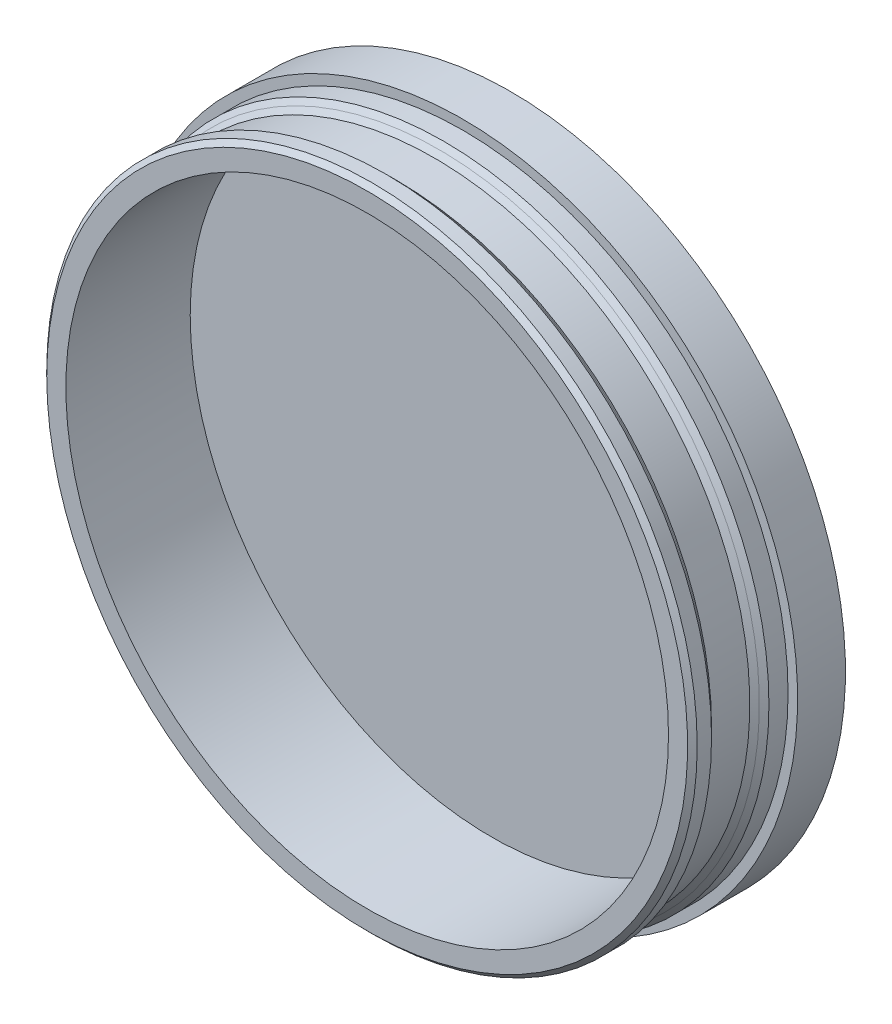
ISO-10303-21;
HEADER;
FILE_DESCRIPTION(('STEP AP214'),'2;1');
FILE_NAME('part.step','',(''),(''),'','','');
FILE_SCHEMA(('AUTOMOTIVE_DESIGN { 1 0 10303 214 1 1 1 1 }'));
ENDSEC;
DATA;
#1=APPLICATION_CONTEXT('core data for automotive mechanical design processes');
#2=APPLICATION_PROTOCOL_DEFINITION('international standard','automotive_design',2000,#1);
#3=PRODUCT_CONTEXT('',#1,'mechanical');
#4=PRODUCT('Part','Part','',(#3));
#5=PRODUCT_RELATED_PRODUCT_CATEGORY('part','',(#4));
#6=PRODUCT_DEFINITION_FORMATION('','',#4);
#7=PRODUCT_DEFINITION_CONTEXT('part definition',#1,'design');
#8=PRODUCT_DEFINITION('design','',#6,#7);
#9=PRODUCT_DEFINITION_SHAPE('','',#8);
#10=(LENGTH_UNIT() NAMED_UNIT(*) SI_UNIT(.MILLI.,.METRE.));
#11=(NAMED_UNIT(*) PLANE_ANGLE_UNIT() SI_UNIT($,.RADIAN.));
#12=(NAMED_UNIT(*) SI_UNIT($,.STERADIAN.) SOLID_ANGLE_UNIT());
#13=UNCERTAINTY_MEASURE_WITH_UNIT(LENGTH_MEASURE(1.E-05),#10,'distance_accuracy_value','');
#14=(GEOMETRIC_REPRESENTATION_CONTEXT(3) GLOBAL_UNCERTAINTY_ASSIGNED_CONTEXT((#13)) GLOBAL_UNIT_ASSIGNED_CONTEXT((#10,
#11,#12)) REPRESENTATION_CONTEXT('',''));
#15=CARTESIAN_POINT('',(0.,0.,0.));
#16=DIRECTION('',(0.,0.,1.));
#17=DIRECTION('',(1.,0.,0.));
#18=AXIS2_PLACEMENT_3D('',#15,#16,#17);
#19=CARTESIAN_POINT('',(34.,0.,0.));
#20=DIRECTION('',(0.,0.,-1.));
#21=DIRECTION('',(-1.,0.,0.));
#22=AXIS2_PLACEMENT_3D('',#19,#20,#21);
#23=PLANE('',#22);
#24=CARTESIAN_POINT('',(0.,0.,0.));
#25=DIRECTION('',(0.,0.,1.));
#26=DIRECTION('',(1.,0.,0.));
#27=AXIS2_PLACEMENT_3D('',#24,#25,#26);
#28=CIRCLE('',#27,31.5);
#29=CARTESIAN_POINT('',(31.5,0.,0.));
#30=VERTEX_POINT('',#29);
#31=EDGE_CURVE('E60',#30,#30,#28,.T.);
#32=ORIENTED_EDGE('',*,*,#31,.F.);
#33=EDGE_LOOP('',(#32));
#34=FACE_BOUND('',#33,.T.);
#35=CARTESIAN_POINT('',(0.,0.,0.));
#36=DIRECTION('',(0.,0.,-1.));
#37=DIRECTION('',(-1.,0.,0.));
#38=AXIS2_PLACEMENT_3D('',#35,#36,#37);
#39=CIRCLE('',#38,33.4999999999999);
#40=CARTESIAN_POINT('',(-33.4999999999999,0.,0.));
#41=VERTEX_POINT('',#40);
#42=EDGE_CURVE('E78',#41,#41,#39,.F.);
#43=ORIENTED_EDGE('',*,*,#42,.T.);
#44=EDGE_LOOP('',(#43));
#45=FACE_BOUND('',#44,.T.);
#46=ADVANCED_FACE('F31',(#34,#45),#23,.F.);
#47=CARTESIAN_POINT('',(28.025,0.,-15.));
#48=DIRECTION('',(0.,0.,1.));
#49=DIRECTION('',(1.,0.,0.));
#50=AXIS2_PLACEMENT_3D('',#47,#48,#49);
#51=PLANE('',#50);
#52=CARTESIAN_POINT('',(0.,0.,-15.));
#53=DIRECTION('',(0.,0.,-1.));
#54=DIRECTION('',(-1.,0.,0.));
#55=AXIS2_PLACEMENT_3D('',#52,#53,#54);
#56=CIRCLE('',#55,35.);
#57=CARTESIAN_POINT('',(-35.,0.,-15.));
#58=VERTEX_POINT('',#57);
#59=EDGE_CURVE('E69',#58,#58,#56,.T.);
#60=ORIENTED_EDGE('',*,*,#59,.T.);
#61=EDGE_LOOP('',(#60));
#62=FACE_BOUND('',#61,.T.);
#63=ADVANCED_FACE('F99',(#62),#51,.F.);
#64=CARTESIAN_POINT('',(0.,0.,-99.29791666667));
#65=DIRECTION('',(0.,0.,-1.));
#66=DIRECTION('',(-1.,0.,0.));
#67=AXIS2_PLACEMENT_3D('',#64,#65,#66);
#68=CYLINDRICAL_SURFACE('',#67,35.);
#69=ORIENTED_EDGE('',*,*,#59,.F.);
#70=EDGE_LOOP('',(#69));
#71=FACE_BOUND('',#70,.T.);
#72=CARTESIAN_POINT('',(0.,0.,-9.99999999999999));
#73=DIRECTION('',(0.,0.,-1.));
#74=DIRECTION('',(-1.,0.,0.));
#75=AXIS2_PLACEMENT_3D('',#72,#73,#74);
#76=CIRCLE('',#75,35.);
#77=CARTESIAN_POINT('',(-35.,0.,-9.99999999999999));
#78=VERTEX_POINT('',#77);
#79=EDGE_CURVE('E53',#78,#78,#76,.T.);
#80=ORIENTED_EDGE('',*,*,#79,.T.);
#81=EDGE_LOOP('',(#80));
#82=FACE_BOUND('',#81,.T.);
#83=ADVANCED_FACE('F107',(#71,#82),#68,.T.);
#84=CARTESIAN_POINT('',(35.,0.,-10.));
#85=DIRECTION('',(0.,0.,-1.));
#86=DIRECTION('',(-1.,0.,0.));
#87=AXIS2_PLACEMENT_3D('',#84,#85,#86);
#88=PLANE('',#87);
#89=ORIENTED_EDGE('',*,*,#79,.F.);
#90=EDGE_LOOP('',(#89));
#91=FACE_BOUND('',#90,.T.);
#92=CARTESIAN_POINT('',(0.,0.,-9.99999999999999));
#93=DIRECTION('',(0.,0.,-1.));
#94=DIRECTION('',(-1.,0.,0.));
#95=AXIS2_PLACEMENT_3D('',#92,#93,#94);
#96=CIRCLE('',#95,34.);
#97=CARTESIAN_POINT('',(-34.,0.,-9.99999999999999));
#98=VERTEX_POINT('',#97);
#99=EDGE_CURVE('E49',#98,#98,#96,.T.);
#100=ORIENTED_EDGE('',*,*,#99,.T.);
#101=EDGE_LOOP('',(#100));
#102=FACE_BOUND('',#101,.T.);
#103=ADVANCED_FACE('F138',(#91,#102),#88,.F.);
#104=CARTESIAN_POINT('',(0.,0.,-99.29791666667));
#105=DIRECTION('',(0.,0.,-1.));
#106=DIRECTION('',(-1.,0.,0.));
#107=AXIS2_PLACEMENT_3D('',#104,#105,#106);
#108=CYLINDRICAL_SURFACE('',#107,34.);
#109=CARTESIAN_POINT('',(0.,0.,-8.00000000000004));
#110=DIRECTION('',(0.,0.,-1.));
#111=DIRECTION('',(-1.,0.,0.));
#112=AXIS2_PLACEMENT_3D('',#109,#110,#111);
#113=CIRCLE('',#112,34.);
#114=CARTESIAN_POINT('',(-34.,0.,-8.00000000000003));
#115=VERTEX_POINT('',#114);
#116=EDGE_CURVE('E10',#115,#115,#113,.T.);
#117=ORIENTED_EDGE('',*,*,#116,.T.);
#118=EDGE_LOOP('',(#117));
#119=FACE_BOUND('',#118,.T.);
#120=ORIENTED_EDGE('',*,*,#99,.F.);
#121=EDGE_LOOP('',(#120));
#122=FACE_BOUND('',#121,.T.);
#123=ADVANCED_FACE('F130',(#119,#122),#108,.T.);
#124=CARTESIAN_POINT('',(0.,0.,-99.29791666667));
#125=DIRECTION('',(0.,0.,-1.));
#126=DIRECTION('',(-1.,0.,0.));
#127=AXIS2_PLACEMENT_3D('',#124,#125,#126);
#128=CYLINDRICAL_SURFACE('',#127,33.);
#129=CARTESIAN_POINT('',(0.,0.,-3.00000000000002));
#130=DIRECTION('',(0.,0.,1.));
#131=DIRECTION('',(1.,0.,0.));
#132=AXIS2_PLACEMENT_3D('',#129,#130,#131);
#133=CIRCLE('',#132,33.);
#134=CARTESIAN_POINT('',(33.,0.,-3.00000000000002));
#135=VERTEX_POINT('',#134);
#136=EDGE_CURVE('E39',#135,#135,#133,.F.);
#137=ORIENTED_EDGE('',*,*,#136,.T.);
#138=EDGE_LOOP('',(#137));
#139=FACE_BOUND('',#138,.T.);
#140=CARTESIAN_POINT('',(0.,0.,-7.00000000000002));
#141=DIRECTION('',(0.,0.,-1.));
#142=DIRECTION('',(-1.,0.,0.));
#143=AXIS2_PLACEMENT_3D('',#140,#141,#142);
#144=CIRCLE('',#143,33.);
#145=CARTESIAN_POINT('',(-33.,0.,-7.00000000000002));
#146=VERTEX_POINT('',#145);
#147=EDGE_CURVE('E44',#146,#146,#144,.F.);
#148=ORIENTED_EDGE('',*,*,#147,.T.);
#149=EDGE_LOOP('',(#148));
#150=FACE_BOUND('',#149,.T.);
#151=ADVANCED_FACE('F83',(#139,#150),#128,.T.);
#152=CARTESIAN_POINT('',(0.,0.,-99.29791666667));
#153=DIRECTION('',(0.,0.,-1.));
#154=DIRECTION('',(-1.,0.,0.));
#155=AXIS2_PLACEMENT_3D('',#152,#153,#154);
#156=CYLINDRICAL_SURFACE('',#155,34.);
#157=CARTESIAN_POINT('',(0.,0.,-0.500000000000042));
#158=DIRECTION('',(0.,0.,-1.));
#159=DIRECTION('',(-1.,0.,0.));
#160=AXIS2_PLACEMENT_3D('',#157,#158,#159);
#161=CIRCLE('',#160,34.);
#162=CARTESIAN_POINT('',(-34.,0.,-0.500000000000038));
#163=VERTEX_POINT('',#162);
#164=EDGE_CURVE('E75',#163,#163,#161,.T.);
#165=ORIENTED_EDGE('',*,*,#164,.T.);
#166=EDGE_LOOP('',(#165));
#167=FACE_BOUND('',#166,.T.);
#168=CARTESIAN_POINT('',(0.,0.,-1.99999999999999));
#169=DIRECTION('',(0.,0.,1.));
#170=DIRECTION('',(1.,0.,0.));
#171=AXIS2_PLACEMENT_3D('',#168,#169,#170);
#172=CIRCLE('',#171,34.);
#173=CARTESIAN_POINT('',(34.,0.,-1.99999999999999));
#174=VERTEX_POINT('',#173);
#175=EDGE_CURVE('E72',#174,#174,#172,.T.);
#176=ORIENTED_EDGE('',*,*,#175,.T.);
#177=EDGE_LOOP('',(#176));
#178=FACE_BOUND('',#177,.T.);
#179=ADVANCED_FACE('F118',(#167,#178),#156,.T.);
#180=CARTESIAN_POINT('',(0.,0.,-0.500000000000042));
#181=DIRECTION('',(0.,0.,-1.));
#182=DIRECTION('',(-1.,0.,0.));
#183=AXIS2_PLACEMENT_3D('',#180,#181,#182);
#184=CONICAL_SURFACE('',#183,34.,0.785398163397455);
#185=ORIENTED_EDGE('',*,*,#42,.F.);
#186=EDGE_LOOP('',(#185));
#187=FACE_BOUND('',#186,.T.);
#188=ORIENTED_EDGE('',*,*,#164,.F.);
#189=EDGE_LOOP('',(#188));
#190=FACE_BOUND('',#189,.T.);
#191=ADVANCED_FACE('F114',(#187,#190),#184,.T.);
#192=CARTESIAN_POINT('',(0.,0.,-3.00000000000002));
#193=DIRECTION('',(0.,0.,1.));
#194=DIRECTION('',(1.,0.,0.));
#195=AXIS2_PLACEMENT_3D('',#192,#193,#194);
#196=CONICAL_SURFACE('',#195,33.,0.785398163397441);
#197=ORIENTED_EDGE('',*,*,#136,.F.);
#198=EDGE_LOOP('',(#197));
#199=FACE_BOUND('',#198,.T.);
#200=CARTESIAN_POINT('',(0.,0.,-2.5));
#201=DIRECTION('',(0.,0.,1.));
#202=DIRECTION('',(1.,0.,0.));
#203=AXIS2_PLACEMENT_3D('',#200,#201,#202);
#204=CIRCLE('',#203,33.5);
#205=CARTESIAN_POINT('',(33.5,0.,-2.5));
#206=VERTEX_POINT('',#205);
#207=EDGE_CURVE('E47',#206,#206,#204,.T.);
#208=ORIENTED_EDGE('',*,*,#207,.F.);
#209=EDGE_LOOP('',(#208));
#210=FACE_BOUND('',#209,.T.);
#211=ADVANCED_FACE('F117',(#199,#210),#196,.T.);
#212=CARTESIAN_POINT('',(0.,0.,-2.5));
#213=DIRECTION('',(0.,0.,1.));
#214=DIRECTION('',(1.,0.,0.));
#215=AXIS2_PLACEMENT_3D('',#212,#213,#214);
#216=CONICAL_SURFACE('',#215,33.5,0.785398163397441);
#217=ORIENTED_EDGE('',*,*,#175,.F.);
#218=EDGE_LOOP('',(#217));
#219=FACE_BOUND('',#218,.T.);
#220=ORIENTED_EDGE('',*,*,#207,.T.);
#221=EDGE_LOOP('',(#220));
#222=FACE_BOUND('',#221,.T.);
#223=ADVANCED_FACE('F95',(#219,#222),#216,.T.);
#224=CARTESIAN_POINT('',(0.,0.,-8.00000000000004));
#225=DIRECTION('',(0.,0.,-1.));
#226=DIRECTION('',(-1.,0.,0.));
#227=AXIS2_PLACEMENT_3D('',#224,#225,#226);
#228=CONICAL_SURFACE('',#227,34.,0.785398163397448);
#229=ORIENTED_EDGE('',*,*,#116,.F.);
#230=EDGE_LOOP('',(#229));
#231=FACE_BOUND('',#230,.T.);
#232=CARTESIAN_POINT('',(0.,0.,-7.5));
#233=DIRECTION('',(0.,0.,-1.));
#234=DIRECTION('',(-1.,0.,0.));
#235=AXIS2_PLACEMENT_3D('',#232,#233,#234);
#236=CIRCLE('',#235,33.4999999999999);
#237=CARTESIAN_POINT('',(-33.4999999999999,0.,-7.49999999999999));
#238=VERTEX_POINT('',#237);
#239=EDGE_CURVE('E35',#238,#238,#236,.F.);
#240=ORIENTED_EDGE('',*,*,#239,.F.);
#241=EDGE_LOOP('',(#240));
#242=FACE_BOUND('',#241,.T.);
#243=ADVANCED_FACE('F33',(#231,#242),#228,.T.);
#244=CARTESIAN_POINT('',(0.,0.,-7.50000000000001));
#245=DIRECTION('',(0.,0.,-1.));
#246=DIRECTION('',(-1.,0.,0.));
#247=AXIS2_PLACEMENT_3D('',#244,#245,#246);
#248=CONICAL_SURFACE('',#247,33.5,0.785398163397441);
#249=ORIENTED_EDGE('',*,*,#147,.F.);
#250=EDGE_LOOP('',(#249));
#251=FACE_BOUND('',#250,.T.);
#252=ORIENTED_EDGE('',*,*,#239,.T.);
#253=EDGE_LOOP('',(#252));
#254=FACE_BOUND('',#253,.T.);
#255=ADVANCED_FACE('F85',(#251,#254),#248,.T.);
#256=CARTESIAN_POINT('',(0.,0.,-102.095454429505));
#257=DIRECTION('',(0.,0.,1.));
#258=DIRECTION('',(1.,0.,0.));
#259=AXIS2_PLACEMENT_3D('',#256,#257,#258);
#260=CYLINDRICAL_SURFACE('',#259,31.5);
#261=ORIENTED_EDGE('',*,*,#31,.T.);
#262=EDGE_LOOP('',(#261));
#263=FACE_BOUND('',#262,.T.);
#264=CARTESIAN_POINT('',(0.,0.,-13.));
#265=DIRECTION('',(0.,0.,-1.));
#266=DIRECTION('',(-1.,0.,0.));
#267=AXIS2_PLACEMENT_3D('',#264,#265,#266);
#268=CIRCLE('',#267,31.5);
#269=CARTESIAN_POINT('',(-31.5,0.,-13.));
#270=VERTEX_POINT('',#269);
#271=EDGE_CURVE('E56',#270,#270,#268,.F.);
#272=ORIENTED_EDGE('',*,*,#271,.F.);
#273=EDGE_LOOP('',(#272));
#274=FACE_BOUND('',#273,.T.);
#275=ADVANCED_FACE('F87',(#263,#274),#260,.F.);
#276=CARTESIAN_POINT('',(0.,0.,-13.));
#277=DIRECTION('',(0.,0.,-1.));
#278=DIRECTION('',(-1.,0.,0.));
#279=AXIS2_PLACEMENT_3D('',#276,#277,#278);
#280=PLANE('',#279);
#281=ORIENTED_EDGE('',*,*,#271,.T.);
#282=EDGE_LOOP('',(#281));
#283=FACE_BOUND('',#282,.T.);
#284=ADVANCED_FACE('F92',(#283),#280,.F.);
#285=CLOSED_SHELL('',(#46,#63,#83,#103,#123,#151,#179,#191,#211,#223,#243,#255,#275,#284));
#286=MANIFOLD_SOLID_BREP('B2',#285);
#287=ADVANCED_BREP_SHAPE_REPRESENTATION('',(#18,#286),#14);
#288=SHAPE_DEFINITION_REPRESENTATION(#9,#287);
ENDSEC;
END-ISO-10303-21;
